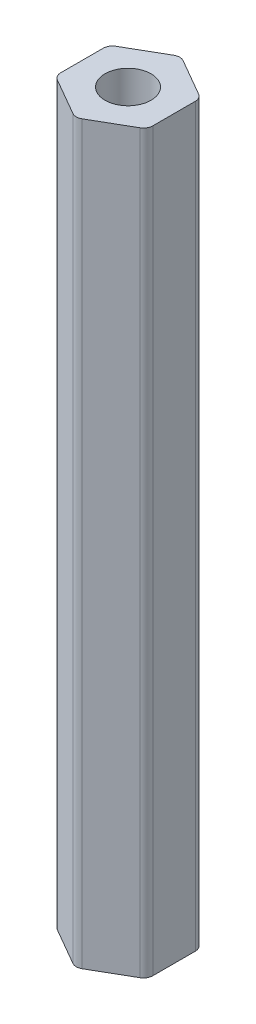
ISO-10303-21;
HEADER;
FILE_DESCRIPTION(('STEP AP214'),'2;1');
FILE_NAME('part.step','',(''),(''),'','','');
FILE_SCHEMA(('AUTOMOTIVE_DESIGN { 1 0 10303 214 1 1 1 1 }'));
ENDSEC;
DATA;
#1=APPLICATION_CONTEXT('core data for automotive mechanical design processes');
#2=APPLICATION_PROTOCOL_DEFINITION('international standard','automotive_design',2000,#1);
#3=PRODUCT_CONTEXT('',#1,'mechanical');
#4=PRODUCT('Part','Part','',(#3));
#5=PRODUCT_RELATED_PRODUCT_CATEGORY('part','',(#4));
#6=PRODUCT_DEFINITION_FORMATION('','',#4);
#7=PRODUCT_DEFINITION_CONTEXT('part definition',#1,'design');
#8=PRODUCT_DEFINITION('design','',#6,#7);
#9=PRODUCT_DEFINITION_SHAPE('','',#8);
#10=(LENGTH_UNIT() NAMED_UNIT(*) SI_UNIT(.MILLI.,.METRE.));
#11=(NAMED_UNIT(*) PLANE_ANGLE_UNIT() SI_UNIT($,.RADIAN.));
#12=(NAMED_UNIT(*) SI_UNIT($,.STERADIAN.) SOLID_ANGLE_UNIT());
#13=UNCERTAINTY_MEASURE_WITH_UNIT(LENGTH_MEASURE(1.E-05),#10,'distance_accuracy_value','');
#14=(GEOMETRIC_REPRESENTATION_CONTEXT(3) GLOBAL_UNCERTAINTY_ASSIGNED_CONTEXT((#13)) GLOBAL_UNIT_ASSIGNED_CONTEXT((#10,
#11,#12)) REPRESENTATION_CONTEXT('',''));
#15=CARTESIAN_POINT('',(0.,0.,0.));
#16=DIRECTION('',(0.,0.,1.));
#17=DIRECTION('',(1.,0.,0.));
#18=AXIS2_PLACEMENT_3D('',#15,#16,#17);
#19=CARTESIAN_POINT('',(0.,8.50000000002638,0.));
#20=DIRECTION('',(0.,-1.,0.));
#21=DIRECTION('',(0.,0.,-1.));
#22=AXIS2_PLACEMENT_3D('',#19,#20,#21);
#23=CONICAL_SURFACE('',#22,1.25000000002728,1.02974425862845);
#24=CARTESIAN_POINT('',(0.,9.25107577387507,0.));
#25=VERTEX_POINT('',#24);
#26=VERTEX_LOOP('',#25);
#27=FACE_BOUND('',#26,.T.);
#28=CARTESIAN_POINT('',(0.,8.49999999999999,0.));
#29=DIRECTION('',(0.,-1.,0.));
#30=DIRECTION('',(0.,0.,-1.));
#31=AXIS2_PLACEMENT_3D('',#28,#29,#30);
#32=CIRCLE('',#31,1.24999999999999);
#33=CARTESIAN_POINT('',(0.,8.49999999999999,-1.24999999999999));
#34=VERTEX_POINT('',#33);
#35=EDGE_CURVE('E186',#34,#34,#32,.T.);
#36=ORIENTED_EDGE('',*,*,#35,.T.);
#37=EDGE_LOOP('',(#36));
#38=FACE_BOUND('',#37,.T.);
#39=ADVANCED_FACE('F17',(#27,#38),#23,.F.);
#40=CARTESIAN_POINT('',(0.,31.4999999998236,0.));
#41=DIRECTION('',(0.,1.,0.));
#42=DIRECTION('',(0.,0.,1.));
#43=AXIS2_PLACEMENT_3D('',#40,#41,#42);
#44=CONICAL_SURFACE('',#43,1.24999999979991,1.02974425852133);
#45=CARTESIAN_POINT('',(0.,30.7489242260601,-5.6843418860808E-11));
#46=VERTEX_POINT('',#45);
#47=VERTEX_LOOP('',#46);
#48=FACE_BOUND('',#47,.T.);
#49=CARTESIAN_POINT('',(0.,31.5,0.));
#50=DIRECTION('',(0.,1.,0.));
#51=DIRECTION('',(0.,0.,1.));
#52=AXIS2_PLACEMENT_3D('',#49,#50,#51);
#53=CIRCLE('',#52,1.24999999999999);
#54=CARTESIAN_POINT('',(0.,31.5,1.24999999999999));
#55=VERTEX_POINT('',#54);
#56=EDGE_CURVE('E182',#55,#55,#53,.T.);
#57=ORIENTED_EDGE('',*,*,#56,.T.);
#58=EDGE_LOOP('',(#57));
#59=FACE_BOUND('',#58,.T.);
#60=ADVANCED_FACE('F386',(#48,#59),#44,.F.);
#61=CARTESIAN_POINT('',(2.00000000000001,40.,1.15470053837923));
#62=DIRECTION('',(0.,-1.,0.));
#63=DIRECTION('',(0.,0.,-1.));
#64=AXIS2_PLACEMENT_3D('',#61,#62,#63);
#65=CYLINDRICAL_SURFACE('',#64,0.5);
#66=CARTESIAN_POINT('',(2.00000000000001,0.,1.15470053837923));
#67=DIRECTION('',(0.,-1.,0.));
#68=DIRECTION('',(0.,0.,-1.));
#69=AXIS2_PLACEMENT_3D('',#66,#67,#68);
#70=CIRCLE('',#69,0.5);
#71=CARTESIAN_POINT('',(2.25000000000002,0.,1.58771324027145));
#72=VERTEX_POINT('',#71);
#73=CARTESIAN_POINT('',(2.50000000000001,0.,1.15470053837923));
#74=VERTEX_POINT('',#73);
#75=EDGE_CURVE('E111',#72,#74,#70,.F.);
#76=ORIENTED_EDGE('',*,*,#75,.T.);
#77=DIRECTION('',(0.,1.,0.));
#78=VECTOR('',#77,1.);
#79=CARTESIAN_POINT('',(2.50000000000001,40.,1.15470053837923));
#80=LINE('',#79,#78);
#81=CARTESIAN_POINT('',(2.50000000000001,40.,1.15470053837923));
#82=VERTEX_POINT('',#81);
#83=EDGE_CURVE('E109',#74,#82,#80,.T.);
#84=ORIENTED_EDGE('',*,*,#83,.T.);
#85=CARTESIAN_POINT('',(2.00000000000001,40.,1.15470053837923));
#86=DIRECTION('',(0.,-1.,0.));
#87=DIRECTION('',(0.,0.,-1.));
#88=AXIS2_PLACEMENT_3D('',#85,#86,#87);
#89=CIRCLE('',#88,0.5);
#90=CARTESIAN_POINT('',(2.25000000000002,40.,1.58771324027145));
#91=VERTEX_POINT('',#90);
#92=EDGE_CURVE('E20',#82,#91,#89,.T.);
#93=ORIENTED_EDGE('',*,*,#92,.T.);
#94=DIRECTION('',(0.,1.,0.));
#95=VECTOR('',#94,1.);
#96=CARTESIAN_POINT('',(2.25000000000002,40.,1.58771324027145));
#97=LINE('',#96,#95);
#98=EDGE_CURVE('E106',#91,#72,#97,.F.);
#99=ORIENTED_EDGE('',*,*,#98,.T.);
#100=EDGE_LOOP('',(#76,#84,#93,#99));
#101=FACE_BOUND('',#100,.T.);
#102=ADVANCED_FACE('F105',(#101),#65,.T.);
#103=CARTESIAN_POINT('',(1.99999999999999,40.,-1.15470053837928));
#104=DIRECTION('',(0.,-1.,0.));
#105=DIRECTION('',(0.,0.,-1.));
#106=AXIS2_PLACEMENT_3D('',#103,#104,#105);
#107=CYLINDRICAL_SURFACE('',#106,0.5);
#108=CARTESIAN_POINT('',(1.99999999999999,0.,-1.15470053837928));
#109=DIRECTION('',(0.,-1.,0.));
#110=DIRECTION('',(0.,0.,-1.));
#111=AXIS2_PLACEMENT_3D('',#108,#109,#110);
#112=CIRCLE('',#111,0.5);
#113=CARTESIAN_POINT('',(2.5,0.,-1.15470053837928));
#114=VERTEX_POINT('',#113);
#115=CARTESIAN_POINT('',(2.24999999999999,0.,-1.5877132402715));
#116=VERTEX_POINT('',#115);
#117=EDGE_CURVE('E206',#114,#116,#112,.F.);
#118=ORIENTED_EDGE('',*,*,#117,.T.);
#119=DIRECTION('',(0.,1.,0.));
#120=VECTOR('',#119,1.);
#121=CARTESIAN_POINT('',(2.24999999999999,40.,-1.5877132402715));
#122=LINE('',#121,#120);
#123=CARTESIAN_POINT('',(2.24999999999999,40.,-1.5877132402715));
#124=VERTEX_POINT('',#123);
#125=EDGE_CURVE('E171',#116,#124,#122,.T.);
#126=ORIENTED_EDGE('',*,*,#125,.T.);
#127=CARTESIAN_POINT('',(1.99999999999999,40.,-1.15470053837928));
#128=DIRECTION('',(0.,-1.,0.));
#129=DIRECTION('',(0.,0.,-1.));
#130=AXIS2_PLACEMENT_3D('',#127,#128,#129);
#131=CIRCLE('',#130,0.5);
#132=CARTESIAN_POINT('',(2.5,40.,-1.15470053837928));
#133=VERTEX_POINT('',#132);
#134=EDGE_CURVE('E208',#124,#133,#131,.T.);
#135=ORIENTED_EDGE('',*,*,#134,.T.);
#136=DIRECTION('',(0.,1.,0.));
#137=VECTOR('',#136,1.);
#138=CARTESIAN_POINT('',(2.49999999999999,40.,-1.15470053837928));
#139=LINE('',#138,#137);
#140=EDGE_CURVE('E119',#133,#114,#139,.F.);
#141=ORIENTED_EDGE('',*,*,#140,.T.);
#142=EDGE_LOOP('',(#118,#126,#135,#141));
#143=FACE_BOUND('',#142,.T.);
#144=ADVANCED_FACE('F219',(#143),#107,.T.);
#145=CARTESIAN_POINT('',(-2.,40.,1.15470053837926));
#146=DIRECTION('',(0.,-1.,0.));
#147=DIRECTION('',(0.,0.,-1.));
#148=AXIS2_PLACEMENT_3D('',#145,#146,#147);
#149=CYLINDRICAL_SURFACE('',#148,0.5);
#150=CARTESIAN_POINT('',(-2.,0.,1.15470053837926));
#151=DIRECTION('',(0.,-1.,0.));
#152=DIRECTION('',(0.,0.,-1.));
#153=AXIS2_PLACEMENT_3D('',#150,#151,#152);
#154=CIRCLE('',#153,0.5);
#155=CARTESIAN_POINT('',(-2.5,0.,1.15470053837926));
#156=VERTEX_POINT('',#155);
#157=CARTESIAN_POINT('',(-2.24999999999999,0.,1.58771324027148));
#158=VERTEX_POINT('',#157);
#159=EDGE_CURVE('E202',#156,#158,#154,.F.);
#160=ORIENTED_EDGE('',*,*,#159,.T.);
#161=DIRECTION('',(0.,1.,0.));
#162=VECTOR('',#161,1.);
#163=CARTESIAN_POINT('',(-2.24999999999999,40.,1.58771324027148));
#164=LINE('',#163,#162);
#165=CARTESIAN_POINT('',(-2.24999999999999,40.,1.58771324027148));
#166=VERTEX_POINT('',#165);
#167=EDGE_CURVE('E161',#158,#166,#164,.T.);
#168=ORIENTED_EDGE('',*,*,#167,.T.);
#169=CARTESIAN_POINT('',(-2.,40.,1.15470053837926));
#170=DIRECTION('',(0.,-1.,0.));
#171=DIRECTION('',(0.,0.,-1.));
#172=AXIS2_PLACEMENT_3D('',#169,#170,#171);
#173=CIRCLE('',#172,0.5);
#174=CARTESIAN_POINT('',(-2.5,40.,1.15470053837926));
#175=VERTEX_POINT('',#174);
#176=EDGE_CURVE('E204',#166,#175,#173,.T.);
#177=ORIENTED_EDGE('',*,*,#176,.T.);
#178=DIRECTION('',(0.,1.,0.));
#179=VECTOR('',#178,1.);
#180=CARTESIAN_POINT('',(-2.5,40.,1.15470053837926));
#181=LINE('',#180,#179);
#182=EDGE_CURVE('E165',#175,#156,#181,.F.);
#183=ORIENTED_EDGE('',*,*,#182,.T.);
#184=EDGE_LOOP('',(#160,#168,#177,#183));
#185=FACE_BOUND('',#184,.T.);
#186=ADVANCED_FACE('F238',(#185),#149,.T.);
#187=CARTESIAN_POINT('',(0.,40.,2.30940107675851));
#188=DIRECTION('',(0.,-1.,0.));
#189=DIRECTION('',(0.,0.,-1.));
#190=AXIS2_PLACEMENT_3D('',#187,#188,#189);
#191=CYLINDRICAL_SURFACE('',#190,0.5);
#192=CARTESIAN_POINT('',(0.,0.,2.30940107675851));
#193=DIRECTION('',(0.,-1.,0.));
#194=DIRECTION('',(0.,0.,-1.));
#195=AXIS2_PLACEMENT_3D('',#192,#193,#194);
#196=CIRCLE('',#195,0.5);
#197=CARTESIAN_POINT('',(-0.249999999999982,0.,2.74241377865073));
#198=VERTEX_POINT('',#197);
#199=CARTESIAN_POINT('',(0.250000000000019,0.,2.74241377865072));
#200=VERTEX_POINT('',#199);
#201=EDGE_CURVE('E189',#198,#200,#196,.F.);
#202=ORIENTED_EDGE('',*,*,#201,.T.);
#203=DIRECTION('',(0.,1.,0.));
#204=VECTOR('',#203,1.);
#205=CARTESIAN_POINT('',(0.25000000000002,40.,2.74241377865072));
#206=LINE('',#205,#204);
#207=CARTESIAN_POINT('',(0.250000000000019,40.,2.74241377865072));
#208=VERTEX_POINT('',#207);
#209=EDGE_CURVE('E120',#200,#208,#206,.T.);
#210=ORIENTED_EDGE('',*,*,#209,.T.);
#211=CARTESIAN_POINT('',(0.,40.,2.30940107675851));
#212=DIRECTION('',(0.,-1.,0.));
#213=DIRECTION('',(0.,0.,-1.));
#214=AXIS2_PLACEMENT_3D('',#211,#212,#213);
#215=CIRCLE('',#214,0.5);
#216=CARTESIAN_POINT('',(-0.249999999999982,40.,2.74241377865073));
#217=VERTEX_POINT('',#216);
#218=EDGE_CURVE('E125',#208,#217,#215,.T.);
#219=ORIENTED_EDGE('',*,*,#218,.T.);
#220=DIRECTION('',(0.,1.,0.));
#221=VECTOR('',#220,1.);
#222=CARTESIAN_POINT('',(-0.249999999999982,40.,2.74241377865073));
#223=LINE('',#222,#221);
#224=EDGE_CURVE('E164',#217,#198,#223,.F.);
#225=ORIENTED_EDGE('',*,*,#224,.T.);
#226=EDGE_LOOP('',(#202,#210,#219,#225));
#227=FACE_BOUND('',#226,.T.);
#228=ADVANCED_FACE('F234',(#227),#191,.T.);
#229=CARTESIAN_POINT('',(0.,0.,0.));
#230=DIRECTION('',(0.,-1.,0.));
#231=DIRECTION('',(0.,0.,-1.));
#232=AXIS2_PLACEMENT_3D('',#229,#230,#231);
#233=CYLINDRICAL_SURFACE('',#232,1.24999999999999);
#234=ORIENTED_EDGE('',*,*,#35,.F.);
#235=EDGE_LOOP('',(#234));
#236=FACE_BOUND('',#235,.T.);
#237=CARTESIAN_POINT('',(0.,0.,0.));
#238=DIRECTION('',(0.,-1.,0.));
#239=DIRECTION('',(0.,0.,-1.));
#240=AXIS2_PLACEMENT_3D('',#237,#238,#239);
#241=CIRCLE('',#240,1.24999999999999);
#242=CARTESIAN_POINT('',(0.,0.,-1.24999999999999));
#243=VERTEX_POINT('',#242);
#244=EDGE_CURVE('E160',#243,#243,#241,.T.);
#245=ORIENTED_EDGE('',*,*,#244,.T.);
#246=EDGE_LOOP('',(#245));
#247=FACE_BOUND('',#246,.T.);
#248=ADVANCED_FACE('F343',(#236,#247),#233,.F.);
#249=CARTESIAN_POINT('',(0.,40.,0.));
#250=DIRECTION('',(0.,1.,0.));
#251=DIRECTION('',(0.,0.,1.));
#252=AXIS2_PLACEMENT_3D('',#249,#250,#251);
#253=CYLINDRICAL_SURFACE('',#252,1.24999999999999);
#254=CARTESIAN_POINT('',(0.,40.,0.));
#255=DIRECTION('',(0.,1.,0.));
#256=DIRECTION('',(0.,0.,1.));
#257=AXIS2_PLACEMENT_3D('',#254,#255,#256);
#258=CIRCLE('',#257,1.24999999999999);
#259=CARTESIAN_POINT('',(0.,40.,1.24999999999999));
#260=VERTEX_POINT('',#259);
#261=EDGE_CURVE('E128',#260,#260,#258,.F.);
#262=ORIENTED_EDGE('',*,*,#261,.F.);
#263=EDGE_LOOP('',(#262));
#264=FACE_BOUND('',#263,.T.);
#265=ORIENTED_EDGE('',*,*,#56,.F.);
#266=EDGE_LOOP('',(#265));
#267=FACE_BOUND('',#266,.T.);
#268=ADVANCED_FACE('F333',(#264,#267),#253,.F.);
#269=CARTESIAN_POINT('',(0.,40.,2.88675134594813));
#270=DIRECTION('',(-0.500000000000007,0.,-0.866025403784434));
#271=DIRECTION('',(-0.866025403784434,0.,0.500000000000007));
#272=AXIS2_PLACEMENT_3D('',#269,#270,#271);
#273=PLANE('',#272);
#274=ORIENTED_EDGE('',*,*,#98,.F.);
#275=DIRECTION('',(0.866025403784434,0.,-0.500000000000007));
#276=VECTOR('',#275,1.);
#277=CARTESIAN_POINT('',(0.250000000000019,40.,2.74241377865072));
#278=LINE('',#277,#276);
#279=EDGE_CURVE('E116',#208,#91,#278,.T.);
#280=ORIENTED_EDGE('',*,*,#279,.F.);
#281=ORIENTED_EDGE('',*,*,#209,.F.);
#282=DIRECTION('',(0.866025403784434,0.,-0.500000000000007));
#283=VECTOR('',#282,1.);
#284=CARTESIAN_POINT('',(0.250000000000019,0.,2.74241377865072));
#285=LINE('',#284,#283);
#286=EDGE_CURVE('E118',#200,#72,#285,.T.);
#287=ORIENTED_EDGE('',*,*,#286,.T.);
#288=EDGE_LOOP('',(#274,#280,#281,#287));
#289=FACE_BOUND('',#288,.T.);
#290=ADVANCED_FACE('F114',(#289),#273,.F.);
#291=CARTESIAN_POINT('',(2.50000000000002,40.,1.44337567297404));
#292=DIRECTION('',(-1.,0.,0.));
#293=DIRECTION('',(0.,0.,1.));
#294=AXIS2_PLACEMENT_3D('',#291,#292,#293);
#295=PLANE('',#294);
#296=ORIENTED_EDGE('',*,*,#83,.F.);
#297=DIRECTION('',(0.,0.,1.));
#298=VECTOR('',#297,1.);
#299=CARTESIAN_POINT('',(2.50000000000001,0.,0.));
#300=LINE('',#299,#298);
#301=EDGE_CURVE('E146',#74,#114,#300,.F.);
#302=ORIENTED_EDGE('',*,*,#301,.T.);
#303=ORIENTED_EDGE('',*,*,#140,.F.);
#304=DIRECTION('',(0.,0.,1.));
#305=VECTOR('',#304,1.);
#306=CARTESIAN_POINT('',(2.50000000000001,40.,0.));
#307=LINE('',#306,#305);
#308=EDGE_CURVE('E127',#82,#133,#307,.F.);
#309=ORIENTED_EDGE('',*,*,#308,.F.);
#310=EDGE_LOOP('',(#296,#302,#303,#309));
#311=FACE_BOUND('',#310,.T.);
#312=ADVANCED_FACE('F212',(#311),#295,.F.);
#313=CARTESIAN_POINT('',(2.49999999999999,40.,-1.44337567297409));
#314=DIRECTION('',(-0.499999999999995,0.,0.866025403784442));
#315=DIRECTION('',(0.866025403784442,0.,0.499999999999995));
#316=AXIS2_PLACEMENT_3D('',#313,#314,#315);
#317=PLANE('',#316);
#318=ORIENTED_EDGE('',*,*,#125,.F.);
#319=DIRECTION('',(-0.866025403784442,0.,-0.499999999999995));
#320=VECTOR('',#319,1.);
#321=CARTESIAN_POINT('',(2.24999999999999,0.,-1.5877132402715));
#322=LINE('',#321,#320);
#323=CARTESIAN_POINT('',(0.25,0.,-2.74241377865073));
#324=VERTEX_POINT('',#323);
#325=EDGE_CURVE('E157',#116,#324,#322,.T.);
#326=ORIENTED_EDGE('',*,*,#325,.T.);
#327=DIRECTION('',(0.,1.,0.));
#328=VECTOR('',#327,1.);
#329=CARTESIAN_POINT('',(0.25,40.,-2.74241377865073));
#330=LINE('',#329,#328);
#331=CARTESIAN_POINT('',(0.25,40.,-2.74241377865073));
#332=VERTEX_POINT('',#331);
#333=EDGE_CURVE('E176',#332,#324,#330,.F.);
#334=ORIENTED_EDGE('',*,*,#333,.F.);
#335=DIRECTION('',(-0.866025403784442,0.,-0.499999999999995));
#336=VECTOR('',#335,1.);
#337=CARTESIAN_POINT('',(2.24999999999999,40.,-1.5877132402715));
#338=LINE('',#337,#336);
#339=EDGE_CURVE('E130',#124,#332,#338,.T.);
#340=ORIENTED_EDGE('',*,*,#339,.F.);
#341=EDGE_LOOP('',(#318,#326,#334,#340));
#342=FACE_BOUND('',#341,.T.);
#343=ADVANCED_FACE('F223',(#342),#317,.F.);
#344=CARTESIAN_POINT('',(-2.50000000000001,40.,-1.44337567297406));
#345=DIRECTION('',(1.,0.,0.));
#346=DIRECTION('',(0.,0.,-1.));
#347=AXIS2_PLACEMENT_3D('',#344,#345,#346);
#348=PLANE('',#347);
#349=ORIENTED_EDGE('',*,*,#182,.F.);
#350=DIRECTION('',(0.,0.,1.));
#351=VECTOR('',#350,1.);
#352=CARTESIAN_POINT('',(-2.5,40.,0.));
#353=LINE('',#352,#351);
#354=CARTESIAN_POINT('',(-2.5,40.,-1.15470053837925));
#355=VERTEX_POINT('',#354);
#356=EDGE_CURVE('E193',#355,#175,#353,.T.);
#357=ORIENTED_EDGE('',*,*,#356,.F.);
#358=DIRECTION('',(0.,-1.,0.));
#359=VECTOR('',#358,1.);
#360=CARTESIAN_POINT('',(-2.5,40.,-1.15470053837925));
#361=LINE('',#360,#359);
#362=CARTESIAN_POINT('',(-2.5,0.,-1.15470053837925));
#363=VERTEX_POINT('',#362);
#364=EDGE_CURVE('E168',#363,#355,#361,.F.);
#365=ORIENTED_EDGE('',*,*,#364,.F.);
#366=DIRECTION('',(0.,0.,1.));
#367=VECTOR('',#366,1.);
#368=CARTESIAN_POINT('',(-2.5,0.,0.));
#369=LINE('',#368,#367);
#370=EDGE_CURVE('E153',#363,#156,#369,.T.);
#371=ORIENTED_EDGE('',*,*,#370,.T.);
#372=EDGE_LOOP('',(#349,#357,#365,#371));
#373=FACE_BOUND('',#372,.T.);
#374=ADVANCED_FACE('F241',(#373),#348,.F.);
#375=CARTESIAN_POINT('',(-2.5,40.,1.44337567297408));
#376=DIRECTION('',(0.499999999999995,0.,-0.866025403784442));
#377=DIRECTION('',(-0.866025403784442,0.,-0.499999999999995));
#378=AXIS2_PLACEMENT_3D('',#375,#376,#377);
#379=PLANE('',#378);
#380=ORIENTED_EDGE('',*,*,#224,.F.);
#381=DIRECTION('',(0.866025403784441,0.,0.499999999999995));
#382=VECTOR('',#381,1.);
#383=CARTESIAN_POINT('',(-2.24999999999999,40.,1.58771324027148));
#384=LINE('',#383,#382);
#385=EDGE_CURVE('E143',#166,#217,#384,.T.);
#386=ORIENTED_EDGE('',*,*,#385,.F.);
#387=ORIENTED_EDGE('',*,*,#167,.F.);
#388=DIRECTION('',(0.866025403784441,0.,0.499999999999995));
#389=VECTOR('',#388,1.);
#390=CARTESIAN_POINT('',(-2.24999999999999,0.,1.58771324027148));
#391=LINE('',#390,#389);
#392=EDGE_CURVE('E150',#158,#198,#391,.T.);
#393=ORIENTED_EDGE('',*,*,#392,.T.);
#394=EDGE_LOOP('',(#380,#386,#387,#393));
#395=FACE_BOUND('',#394,.T.);
#396=ADVANCED_FACE('F231',(#395),#379,.F.);
#397=CARTESIAN_POINT('',(-2.,40.,-1.15470053837925));
#398=DIRECTION('',(0.,-1.,0.));
#399=DIRECTION('',(0.,0.,-1.));
#400=AXIS2_PLACEMENT_3D('',#397,#398,#399);
#401=CYLINDRICAL_SURFACE('',#400,0.5);
#402=CARTESIAN_POINT('',(-2.,0.,-1.15470053837925));
#403=DIRECTION('',(0.,-1.,0.));
#404=DIRECTION('',(0.,0.,-1.));
#405=AXIS2_PLACEMENT_3D('',#402,#403,#404);
#406=CIRCLE('',#405,0.5);
#407=CARTESIAN_POINT('',(-2.25000000000001,0.,-1.58771324027147));
#408=VERTEX_POINT('',#407);
#409=EDGE_CURVE('E156',#408,#363,#406,.F.);
#410=ORIENTED_EDGE('',*,*,#409,.T.);
#411=ORIENTED_EDGE('',*,*,#364,.T.);
#412=CARTESIAN_POINT('',(-2.,40.,-1.15470053837925));
#413=DIRECTION('',(0.,-1.,0.));
#414=DIRECTION('',(0.,0.,-1.));
#415=AXIS2_PLACEMENT_3D('',#412,#413,#414);
#416=CIRCLE('',#415,0.5);
#417=CARTESIAN_POINT('',(-2.25000000000001,40.,-1.58771324027147));
#418=VERTEX_POINT('',#417);
#419=EDGE_CURVE('E190',#418,#355,#416,.F.);
#420=ORIENTED_EDGE('',*,*,#419,.F.);
#421=DIRECTION('',(0.,1.,0.));
#422=VECTOR('',#421,1.);
#423=CARTESIAN_POINT('',(-2.25000000000001,40.,-1.58771324027147));
#424=LINE('',#423,#422);
#425=EDGE_CURVE('E140',#418,#408,#424,.F.);
#426=ORIENTED_EDGE('',*,*,#425,.T.);
#427=EDGE_LOOP('',(#410,#411,#420,#426));
#428=FACE_BOUND('',#427,.T.);
#429=ADVANCED_FACE('F244',(#428),#401,.T.);
#430=CARTESIAN_POINT('',(0.,0.,0.));
#431=DIRECTION('',(0.,1.,0.));
#432=DIRECTION('',(0.,0.,1.));
#433=AXIS2_PLACEMENT_3D('',#430,#431,#432);
#434=PLANE('',#433);
#435=ORIENTED_EDGE('',*,*,#75,.F.);
#436=ORIENTED_EDGE('',*,*,#286,.F.);
#437=ORIENTED_EDGE('',*,*,#201,.F.);
#438=ORIENTED_EDGE('',*,*,#392,.F.);
#439=ORIENTED_EDGE('',*,*,#159,.F.);
#440=ORIENTED_EDGE('',*,*,#370,.F.);
#441=ORIENTED_EDGE('',*,*,#409,.F.);
#442=DIRECTION('',(0.866025403784438,0.,-0.500000000000001));
#443=VECTOR('',#442,1.);
#444=CARTESIAN_POINT('',(0.,0.,-2.88675134594813));
#445=LINE('',#444,#443);
#446=CARTESIAN_POINT('',(-0.249999999999998,0.,-2.74241377865073));
#447=VERTEX_POINT('',#446);
#448=EDGE_CURVE('E138',#408,#447,#445,.T.);
#449=ORIENTED_EDGE('',*,*,#448,.T.);
#450=CARTESIAN_POINT('',(0.,0.,-2.30940107675851));
#451=DIRECTION('',(0.,-1.,0.));
#452=DIRECTION('',(0.,0.,-1.));
#453=AXIS2_PLACEMENT_3D('',#450,#451,#452);
#454=CIRCLE('',#453,0.5);
#455=EDGE_CURVE('E133',#324,#447,#454,.F.);
#456=ORIENTED_EDGE('',*,*,#455,.F.);
#457=ORIENTED_EDGE('',*,*,#325,.F.);
#458=ORIENTED_EDGE('',*,*,#117,.F.);
#459=ORIENTED_EDGE('',*,*,#301,.F.);
#460=EDGE_LOOP('',(#435,#436,#437,#438,#439,#440,#441,#449,#456,#457,#458,#459));
#461=FACE_BOUND('',#460,.T.);
#462=ORIENTED_EDGE('',*,*,#244,.F.);
#463=EDGE_LOOP('',(#462));
#464=FACE_BOUND('',#463,.T.);
#465=ADVANCED_FACE('F214',(#461,#464),#434,.F.);
#466=CARTESIAN_POINT('',(0.,40.,-2.30940107675851));
#467=DIRECTION('',(0.,-1.,0.));
#468=DIRECTION('',(0.,0.,-1.));
#469=AXIS2_PLACEMENT_3D('',#466,#467,#468);
#470=CYLINDRICAL_SURFACE('',#469,0.5);
#471=ORIENTED_EDGE('',*,*,#455,.T.);
#472=DIRECTION('',(0.,1.,0.));
#473=VECTOR('',#472,1.);
#474=CARTESIAN_POINT('',(-0.249999999999998,40.,-2.74241377865073));
#475=LINE('',#474,#473);
#476=CARTESIAN_POINT('',(-0.249999999999998,40.,-2.74241377865073));
#477=VERTEX_POINT('',#476);
#478=EDGE_CURVE('E26',#447,#477,#475,.T.);
#479=ORIENTED_EDGE('',*,*,#478,.T.);
#480=CARTESIAN_POINT('',(0.,40.,-2.30940107675851));
#481=DIRECTION('',(0.,-1.,0.));
#482=DIRECTION('',(0.,0.,-1.));
#483=AXIS2_PLACEMENT_3D('',#480,#481,#482);
#484=CIRCLE('',#483,0.5);
#485=EDGE_CURVE('E34',#332,#477,#484,.F.);
#486=ORIENTED_EDGE('',*,*,#485,.F.);
#487=ORIENTED_EDGE('',*,*,#333,.T.);
#488=EDGE_LOOP('',(#471,#479,#486,#487));
#489=FACE_BOUND('',#488,.T.);
#490=ADVANCED_FACE('F251',(#489),#470,.T.);
#491=CARTESIAN_POINT('',(0.,40.,0.));
#492=DIRECTION('',(0.,1.,0.));
#493=DIRECTION('',(0.,0.,1.));
#494=AXIS2_PLACEMENT_3D('',#491,#492,#493);
#495=PLANE('',#494);
#496=ORIENTED_EDGE('',*,*,#385,.T.);
#497=ORIENTED_EDGE('',*,*,#218,.F.);
#498=ORIENTED_EDGE('',*,*,#279,.T.);
#499=ORIENTED_EDGE('',*,*,#92,.F.);
#500=ORIENTED_EDGE('',*,*,#308,.T.);
#501=ORIENTED_EDGE('',*,*,#134,.F.);
#502=ORIENTED_EDGE('',*,*,#339,.T.);
#503=ORIENTED_EDGE('',*,*,#485,.T.);
#504=DIRECTION('',(0.866025403784438,0.,-0.500000000000001));
#505=VECTOR('',#504,1.);
#506=CARTESIAN_POINT('',(0.,40.,-2.88675134594813));
#507=LINE('',#506,#505);
#508=EDGE_CURVE('E11',#477,#418,#507,.F.);
#509=ORIENTED_EDGE('',*,*,#508,.T.);
#510=ORIENTED_EDGE('',*,*,#419,.T.);
#511=ORIENTED_EDGE('',*,*,#356,.T.);
#512=ORIENTED_EDGE('',*,*,#176,.F.);
#513=EDGE_LOOP('',(#496,#497,#498,#499,#500,#501,#502,#503,#509,#510,#511,#512));
#514=FACE_BOUND('',#513,.T.);
#515=ORIENTED_EDGE('',*,*,#261,.T.);
#516=EDGE_LOOP('',(#515));
#517=FACE_BOUND('',#516,.T.);
#518=ADVANCED_FACE('F123',(#514,#517),#495,.T.);
#519=CARTESIAN_POINT('',(0.,40.,-2.88675134594813));
#520=DIRECTION('',(0.500000000000001,0.,0.866025403784438));
#521=DIRECTION('',(0.866025403784438,0.,-0.500000000000001));
#522=AXIS2_PLACEMENT_3D('',#519,#520,#521);
#523=PLANE('',#522);
#524=ORIENTED_EDGE('',*,*,#478,.F.);
#525=ORIENTED_EDGE('',*,*,#448,.F.);
#526=ORIENTED_EDGE('',*,*,#425,.F.);
#527=ORIENTED_EDGE('',*,*,#508,.F.);
#528=EDGE_LOOP('',(#524,#525,#526,#527));
#529=FACE_BOUND('',#528,.T.);
#530=ADVANCED_FACE('F248',(#529),#523,.F.);
#531=CLOSED_SHELL('',(#39,#60,#102,#144,#186,#228,#248,#268,#290,#312,#343,#374,#396,#429,#465,
#490,#518,#530));
#532=MANIFOLD_SOLID_BREP('B1',#531);
#533=ADVANCED_BREP_SHAPE_REPRESENTATION('',(#18,#532),#14);
#534=SHAPE_DEFINITION_REPRESENTATION(#9,#533);
ENDSEC;
END-ISO-10303-21;
